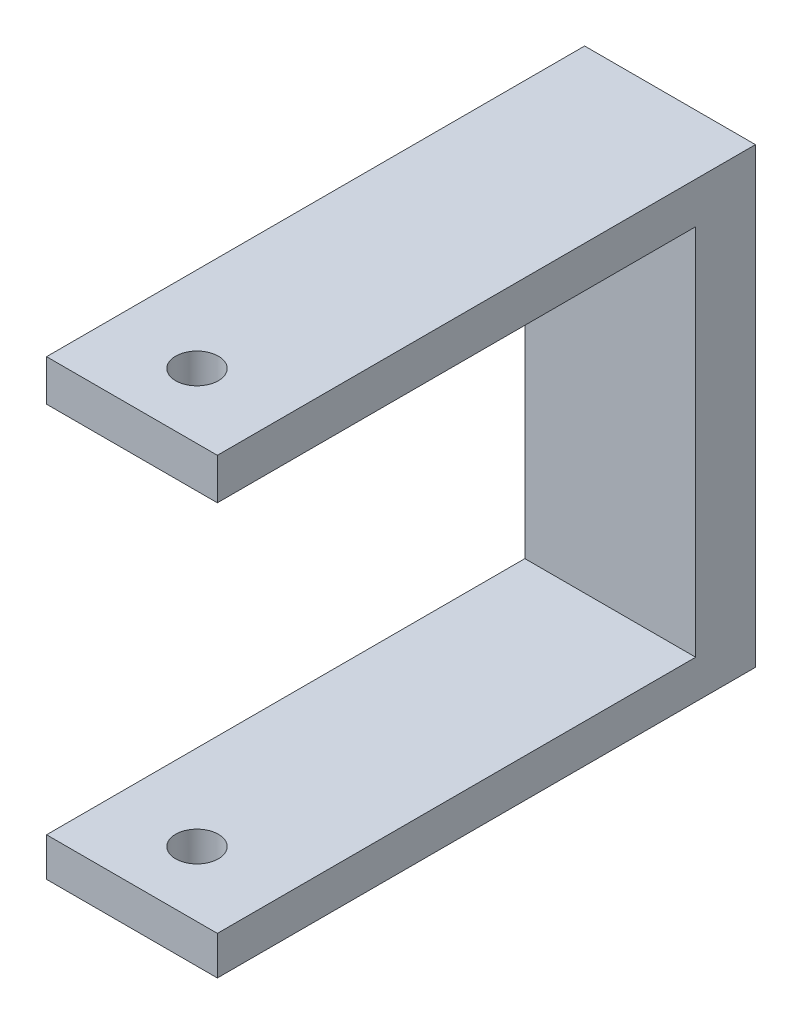
ISO-10303-21;
HEADER;
FILE_DESCRIPTION(('STEP AP214'),'2;1');
FILE_NAME('part.step','',(''),(''),'','','');
FILE_SCHEMA(('AUTOMOTIVE_DESIGN { 1 0 10303 214 1 1 1 1 }'));
ENDSEC;
DATA;
#1=APPLICATION_CONTEXT('core data for automotive mechanical design processes');
#2=APPLICATION_PROTOCOL_DEFINITION('international standard','automotive_design',2000,#1);
#3=PRODUCT_CONTEXT('',#1,'mechanical');
#4=PRODUCT('Part','Part','',(#3));
#5=PRODUCT_RELATED_PRODUCT_CATEGORY('part','',(#4));
#6=PRODUCT_DEFINITION_FORMATION('','',#4);
#7=PRODUCT_DEFINITION_CONTEXT('part definition',#1,'design');
#8=PRODUCT_DEFINITION('design','',#6,#7);
#9=PRODUCT_DEFINITION_SHAPE('','',#8);
#10=(LENGTH_UNIT() NAMED_UNIT(*) SI_UNIT(.MILLI.,.METRE.));
#11=(NAMED_UNIT(*) PLANE_ANGLE_UNIT() SI_UNIT($,.RADIAN.));
#12=(NAMED_UNIT(*) SI_UNIT($,.STERADIAN.) SOLID_ANGLE_UNIT());
#13=UNCERTAINTY_MEASURE_WITH_UNIT(LENGTH_MEASURE(1.E-05),#10,'distance_accuracy_value','');
#14=(GEOMETRIC_REPRESENTATION_CONTEXT(3) GLOBAL_UNCERTAINTY_ASSIGNED_CONTEXT((#13)) GLOBAL_UNIT_ASSIGNED_CONTEXT((#10,
#11,#12)) REPRESENTATION_CONTEXT('',''));
#15=CARTESIAN_POINT('',(0.,0.,0.));
#16=DIRECTION('',(0.,0.,1.));
#17=DIRECTION('',(1.,0.,0.));
#18=AXIS2_PLACEMENT_3D('',#15,#16,#17);
#19=CARTESIAN_POINT('',(10.,53.,-50.));
#20=DIRECTION('',(-1.,0.,0.));
#21=DIRECTION('',(0.,0.,1.));
#22=AXIS2_PLACEMENT_3D('',#19,#20,#21);
#23=PLANE('',#22);
#24=DIRECTION('',(0.,1.,0.));
#25=VECTOR('',#24,1.);
#26=CARTESIAN_POINT('',(10.,53.,13.));
#27=LINE('',#26,#25);
#28=CARTESIAN_POINT('',(10.,0.,13.));
#29=VERTEX_POINT('',#28);
#30=CARTESIAN_POINT('',(10.,4.52405347124341,13.));
#31=VERTEX_POINT('',#30);
#32=EDGE_CURVE('E47',#29,#31,#27,.T.);
#33=ORIENTED_EDGE('',*,*,#32,.F.);
#34=DIRECTION('',(0.,0.,-1.));
#35=VECTOR('',#34,1.);
#36=CARTESIAN_POINT('',(10.,0.,-50.));
#37=LINE('',#36,#35);
#38=CARTESIAN_POINT('',(10.,0.,-50.));
#39=VERTEX_POINT('',#38);
#40=EDGE_CURVE('E110',#29,#39,#37,.T.);
#41=ORIENTED_EDGE('',*,*,#40,.T.);
#42=DIRECTION('',(0.,-1.,0.));
#43=VECTOR('',#42,1.);
#44=CARTESIAN_POINT('',(10.,53.,-50.));
#45=LINE('',#44,#43);
#46=CARTESIAN_POINT('',(10.,53.,-50.));
#47=VERTEX_POINT('',#46);
#48=EDGE_CURVE('E40',#47,#39,#45,.T.);
#49=ORIENTED_EDGE('',*,*,#48,.F.);
#50=DIRECTION('',(0.,0.,-1.));
#51=VECTOR('',#50,1.);
#52=CARTESIAN_POINT('',(10.,53.,-50.));
#53=LINE('',#52,#51);
#54=CARTESIAN_POINT('',(10.,53.,13.));
#55=VERTEX_POINT('',#54);
#56=EDGE_CURVE('E118',#55,#47,#53,.T.);
#57=ORIENTED_EDGE('',*,*,#56,.F.);
#58=CARTESIAN_POINT('',(10.,48.1796211530856,13.));
#59=VERTEX_POINT('',#58);
#60=EDGE_CURVE('E111',#59,#55,#27,.T.);
#61=ORIENTED_EDGE('',*,*,#60,.F.);
#62=DIRECTION('',(0.,0.,1.));
#63=VECTOR('',#62,1.);
#64=CARTESIAN_POINT('',(10.,48.1796211530856,-43.));
#65=LINE('',#64,#63);
#66=CARTESIAN_POINT('',(10.,48.1796211530856,-43.));
#67=VERTEX_POINT('',#66);
#68=EDGE_CURVE('E151',#67,#59,#65,.T.);
#69=ORIENTED_EDGE('',*,*,#68,.F.);
#70=DIRECTION('',(0.,1.,0.));
#71=VECTOR('',#70,1.);
#72=CARTESIAN_POINT('',(10.,4.52405347124341,-43.));
#73=LINE('',#72,#71);
#74=CARTESIAN_POINT('',(10.,4.52405347124341,-43.));
#75=VERTEX_POINT('',#74);
#76=EDGE_CURVE('E155',#75,#67,#73,.T.);
#77=ORIENTED_EDGE('',*,*,#76,.F.);
#78=DIRECTION('',(0.,0.,1.));
#79=VECTOR('',#78,1.);
#80=CARTESIAN_POINT('',(10.,4.52405347124341,-43.));
#81=LINE('',#80,#79);
#82=EDGE_CURVE('E165',#75,#31,#81,.T.);
#83=ORIENTED_EDGE('',*,*,#82,.T.);
#84=EDGE_LOOP('',(#33,#41,#49,#57,#61,#69,#77,#83));
#85=FACE_BOUND('',#84,.T.);
#86=ADVANCED_FACE('F33',(#85),#23,.F.);
#87=CARTESIAN_POINT('',(-10.,53.,-50.));
#88=DIRECTION('',(1.,0.,0.));
#89=DIRECTION('',(0.,0.,-1.));
#90=AXIS2_PLACEMENT_3D('',#87,#88,#89);
#91=PLANE('',#90);
#92=DIRECTION('',(0.,-1.,0.));
#93=VECTOR('',#92,1.);
#94=CARTESIAN_POINT('',(-10.,53.,13.));
#95=LINE('',#94,#93);
#96=CARTESIAN_POINT('',(-10.,53.,13.));
#97=VERTEX_POINT('',#96);
#98=CARTESIAN_POINT('',(-10.,48.1796211530856,13.));
#99=VERTEX_POINT('',#98);
#100=EDGE_CURVE('E54',#97,#99,#95,.T.);
#101=ORIENTED_EDGE('',*,*,#100,.F.);
#102=DIRECTION('',(0.,0.,1.));
#103=VECTOR('',#102,1.);
#104=CARTESIAN_POINT('',(-10.,53.,-50.));
#105=LINE('',#104,#103);
#106=CARTESIAN_POINT('',(-10.,53.,-50.));
#107=VERTEX_POINT('',#106);
#108=EDGE_CURVE('E127',#107,#97,#105,.T.);
#109=ORIENTED_EDGE('',*,*,#108,.F.);
#110=DIRECTION('',(0.,-1.,0.));
#111=VECTOR('',#110,1.);
#112=CARTESIAN_POINT('',(-10.,53.,-50.));
#113=LINE('',#112,#111);
#114=CARTESIAN_POINT('',(-10.,0.,-50.));
#115=VERTEX_POINT('',#114);
#116=EDGE_CURVE('E117',#107,#115,#113,.T.);
#117=ORIENTED_EDGE('',*,*,#116,.T.);
#118=DIRECTION('',(0.,0.,1.));
#119=VECTOR('',#118,1.);
#120=CARTESIAN_POINT('',(-10.,0.,-50.));
#121=LINE('',#120,#119);
#122=CARTESIAN_POINT('',(-10.,0.,13.));
#123=VERTEX_POINT('',#122);
#124=EDGE_CURVE('E109',#115,#123,#121,.T.);
#125=ORIENTED_EDGE('',*,*,#124,.T.);
#126=CARTESIAN_POINT('',(-10.,4.52405347124341,13.));
#127=VERTEX_POINT('',#126);
#128=EDGE_CURVE('E94',#127,#123,#95,.T.);
#129=ORIENTED_EDGE('',*,*,#128,.F.);
#130=DIRECTION('',(0.,0.,1.));
#131=VECTOR('',#130,1.);
#132=CARTESIAN_POINT('',(-10.,4.52405347124341,-43.));
#133=LINE('',#132,#131);
#134=CARTESIAN_POINT('',(-10.,4.52405347124341,-43.));
#135=VERTEX_POINT('',#134);
#136=EDGE_CURVE('E164',#135,#127,#133,.T.);
#137=ORIENTED_EDGE('',*,*,#136,.F.);
#138=DIRECTION('',(0.,-1.,0.));
#139=VECTOR('',#138,1.);
#140=CARTESIAN_POINT('',(-10.,4.52405347124341,-43.));
#141=LINE('',#140,#139);
#142=CARTESIAN_POINT('',(-10.,48.1796211530856,-43.));
#143=VERTEX_POINT('',#142);
#144=EDGE_CURVE('E159',#143,#135,#141,.T.);
#145=ORIENTED_EDGE('',*,*,#144,.F.);
#146=DIRECTION('',(0.,0.,1.));
#147=VECTOR('',#146,1.);
#148=CARTESIAN_POINT('',(-10.,48.1796211530856,-43.));
#149=LINE('',#148,#147);
#150=EDGE_CURVE('E152',#143,#99,#149,.T.);
#151=ORIENTED_EDGE('',*,*,#150,.T.);
#152=EDGE_LOOP('',(#101,#109,#117,#125,#129,#137,#145,#151));
#153=FACE_BOUND('',#152,.T.);
#154=ADVANCED_FACE('F114',(#153),#91,.F.);
#155=CARTESIAN_POINT('',(0.,53.,0.));
#156=DIRECTION('',(0.,1.,0.));
#157=DIRECTION('',(0.,0.,1.));
#158=AXIS2_PLACEMENT_3D('',#155,#156,#157);
#159=PLANE('',#158);
#160=CARTESIAN_POINT('',(0.,53.,5.38561240630386));
#161=DIRECTION('',(0.,1.,0.));
#162=DIRECTION('',(0.,0.,1.));
#163=AXIS2_PLACEMENT_3D('',#160,#161,#162);
#164=CIRCLE('',#163,2.5);
#165=CARTESIAN_POINT('',(0.,53.,7.88561240630386));
#166=VERTEX_POINT('',#165);
#167=EDGE_CURVE('E132',#166,#166,#164,.T.);
#168=ORIENTED_EDGE('',*,*,#167,.F.);
#169=EDGE_LOOP('',(#168));
#170=FACE_BOUND('',#169,.T.);
#171=ORIENTED_EDGE('',*,*,#108,.T.);
#172=DIRECTION('',(-1.,0.,0.));
#173=VECTOR('',#172,1.);
#174=CARTESIAN_POINT('',(-10.,53.,13.));
#175=LINE('',#174,#173);
#176=EDGE_CURVE('E142',#55,#97,#175,.T.);
#177=ORIENTED_EDGE('',*,*,#176,.F.);
#178=ORIENTED_EDGE('',*,*,#56,.T.);
#179=DIRECTION('',(-1.,0.,0.));
#180=VECTOR('',#179,1.);
#181=CARTESIAN_POINT('',(-10.,53.,-50.));
#182=LINE('',#181,#180);
#183=EDGE_CURVE('E121',#47,#107,#182,.T.);
#184=ORIENTED_EDGE('',*,*,#183,.T.);
#185=EDGE_LOOP('',(#171,#177,#178,#184));
#186=FACE_BOUND('',#185,.T.);
#187=ADVANCED_FACE('F178',(#170,#186),#159,.T.);
#188=CARTESIAN_POINT('',(0.,0.,0.));
#189=DIRECTION('',(0.,1.,0.));
#190=DIRECTION('',(0.,0.,1.));
#191=AXIS2_PLACEMENT_3D('',#188,#189,#190);
#192=PLANE('',#191);
#193=CARTESIAN_POINT('',(0.,0.,5.38561240630386));
#194=DIRECTION('',(0.,1.,0.));
#195=DIRECTION('',(0.,0.,1.));
#196=AXIS2_PLACEMENT_3D('',#193,#194,#195);
#197=CIRCLE('',#196,2.5);
#198=CARTESIAN_POINT('',(0.,0.,7.88561240630386));
#199=VERTEX_POINT('',#198);
#200=EDGE_CURVE('E136',#199,#199,#197,.T.);
#201=ORIENTED_EDGE('',*,*,#200,.T.);
#202=EDGE_LOOP('',(#201));
#203=FACE_BOUND('',#202,.T.);
#204=DIRECTION('',(1.,0.,0.));
#205=VECTOR('',#204,1.);
#206=CARTESIAN_POINT('',(-10.,0.,13.));
#207=LINE('',#206,#205);
#208=EDGE_CURVE('E97',#123,#29,#207,.T.);
#209=ORIENTED_EDGE('',*,*,#208,.F.);
#210=ORIENTED_EDGE('',*,*,#124,.F.);
#211=DIRECTION('',(-1.,0.,0.));
#212=VECTOR('',#211,1.);
#213=CARTESIAN_POINT('',(-10.,0.,-50.));
#214=LINE('',#213,#212);
#215=EDGE_CURVE('E119',#39,#115,#214,.T.);
#216=ORIENTED_EDGE('',*,*,#215,.F.);
#217=ORIENTED_EDGE('',*,*,#40,.F.);
#218=EDGE_LOOP('',(#209,#210,#216,#217));
#219=FACE_BOUND('',#218,.T.);
#220=ADVANCED_FACE('F107',(#203,#219),#192,.F.);
#221=CARTESIAN_POINT('',(10.,4.52405347124341,-43.));
#222=DIRECTION('',(0.,-1.,0.));
#223=DIRECTION('',(0.,0.,-1.));
#224=AXIS2_PLACEMENT_3D('',#221,#222,#223);
#225=PLANE('',#224);
#226=CARTESIAN_POINT('',(0.,4.52405347124341,5.38561240630386));
#227=DIRECTION('',(0.,-1.,0.));
#228=DIRECTION('',(0.,0.,-1.));
#229=AXIS2_PLACEMENT_3D('',#226,#227,#228);
#230=CIRCLE('',#229,2.5);
#231=CARTESIAN_POINT('',(0.,4.52405347124341,2.88561240630386));
#232=VERTEX_POINT('',#231);
#233=EDGE_CURVE('E131',#232,#232,#230,.T.);
#234=ORIENTED_EDGE('',*,*,#233,.T.);
#235=EDGE_LOOP('',(#234));
#236=FACE_BOUND('',#235,.T.);
#237=DIRECTION('',(-1.,0.,0.));
#238=VECTOR('',#237,1.);
#239=CARTESIAN_POINT('',(10.,4.52405347124341,13.));
#240=LINE('',#239,#238);
#241=EDGE_CURVE('E98',#31,#127,#240,.T.);
#242=ORIENTED_EDGE('',*,*,#241,.F.);
#243=ORIENTED_EDGE('',*,*,#82,.F.);
#244=DIRECTION('',(1.,0.,0.));
#245=VECTOR('',#244,1.);
#246=CARTESIAN_POINT('',(10.,4.52405347124341,-43.));
#247=LINE('',#246,#245);
#248=EDGE_CURVE('E161',#135,#75,#247,.T.);
#249=ORIENTED_EDGE('',*,*,#248,.F.);
#250=ORIENTED_EDGE('',*,*,#136,.T.);
#251=EDGE_LOOP('',(#242,#243,#249,#250));
#252=FACE_BOUND('',#251,.T.);
#253=ADVANCED_FACE('F192',(#236,#252),#225,.F.);
#254=CARTESIAN_POINT('',(10.,48.1796211530856,-43.));
#255=DIRECTION('',(0.,1.,0.));
#256=DIRECTION('',(0.,0.,1.));
#257=AXIS2_PLACEMENT_3D('',#254,#255,#256);
#258=PLANE('',#257);
#259=CARTESIAN_POINT('',(0.,48.1796211530856,5.38561240630386));
#260=DIRECTION('',(0.,1.,0.));
#261=DIRECTION('',(0.,0.,1.));
#262=AXIS2_PLACEMENT_3D('',#259,#260,#261);
#263=CIRCLE('',#262,2.5);
#264=CARTESIAN_POINT('',(0.,48.1796211530856,7.88561240630386));
#265=VERTEX_POINT('',#264);
#266=EDGE_CURVE('E129',#265,#265,#263,.T.);
#267=ORIENTED_EDGE('',*,*,#266,.T.);
#268=EDGE_LOOP('',(#267));
#269=FACE_BOUND('',#268,.T.);
#270=DIRECTION('',(1.,0.,0.));
#271=VECTOR('',#270,1.);
#272=CARTESIAN_POINT('',(10.,48.1796211530856,13.));
#273=LINE('',#272,#271);
#274=EDGE_CURVE('E11',#99,#59,#273,.T.);
#275=ORIENTED_EDGE('',*,*,#274,.F.);
#276=ORIENTED_EDGE('',*,*,#150,.F.);
#277=DIRECTION('',(-1.,0.,0.));
#278=VECTOR('',#277,1.);
#279=CARTESIAN_POINT('',(10.,48.1796211530856,-43.));
#280=LINE('',#279,#278);
#281=EDGE_CURVE('E148',#67,#143,#280,.T.);
#282=ORIENTED_EDGE('',*,*,#281,.F.);
#283=ORIENTED_EDGE('',*,*,#68,.T.);
#284=EDGE_LOOP('',(#275,#276,#282,#283));
#285=FACE_BOUND('',#284,.T.);
#286=ADVANCED_FACE('F186',(#269,#285),#258,.F.);
#287=CARTESIAN_POINT('',(-10.,53.,-50.));
#288=DIRECTION('',(0.,0.,1.));
#289=DIRECTION('',(1.,0.,0.));
#290=AXIS2_PLACEMENT_3D('',#287,#288,#289);
#291=PLANE('',#290);
#292=ORIENTED_EDGE('',*,*,#215,.T.);
#293=ORIENTED_EDGE('',*,*,#116,.F.);
#294=ORIENTED_EDGE('',*,*,#183,.F.);
#295=ORIENTED_EDGE('',*,*,#48,.T.);
#296=EDGE_LOOP('',(#292,#293,#294,#295));
#297=FACE_BOUND('',#296,.T.);
#298=ADVANCED_FACE('F176',(#297),#291,.F.);
#299=CARTESIAN_POINT('',(0.,0.,-43.));
#300=DIRECTION('',(0.,0.,1.));
#301=DIRECTION('',(1.,0.,0.));
#302=AXIS2_PLACEMENT_3D('',#299,#300,#301);
#303=PLANE('',#302);
#304=ORIENTED_EDGE('',*,*,#76,.T.);
#305=ORIENTED_EDGE('',*,*,#281,.T.);
#306=ORIENTED_EDGE('',*,*,#144,.T.);
#307=ORIENTED_EDGE('',*,*,#248,.T.);
#308=EDGE_LOOP('',(#304,#305,#306,#307));
#309=FACE_BOUND('',#308,.T.);
#310=ADVANCED_FACE('F189',(#309),#303,.T.);
#311=CARTESIAN_POINT('',(0.,-17.,5.38561240630386));
#312=DIRECTION('',(0.,1.,0.));
#313=DIRECTION('',(0.,0.,1.));
#314=AXIS2_PLACEMENT_3D('',#311,#312,#313);
#315=CYLINDRICAL_SURFACE('',#314,2.5);
#316=ORIENTED_EDGE('',*,*,#167,.T.);
#317=EDGE_LOOP('',(#316));
#318=FACE_BOUND('',#317,.T.);
#319=ORIENTED_EDGE('',*,*,#266,.F.);
#320=EDGE_LOOP('',(#319));
#321=FACE_BOUND('',#320,.T.);
#322=ADVANCED_FACE('F201',(#318,#321),#315,.F.);
#323=ORIENTED_EDGE('',*,*,#233,.F.);
#324=EDGE_LOOP('',(#323));
#325=FACE_BOUND('',#324,.T.);
#326=ORIENTED_EDGE('',*,*,#200,.F.);
#327=EDGE_LOOP('',(#326));
#328=FACE_BOUND('',#327,.T.);
#329=ADVANCED_FACE('F195',(#325,#328),#315,.F.);
#330=CARTESIAN_POINT('',(0.,0.,13.));
#331=DIRECTION('',(0.,0.,1.));
#332=DIRECTION('',(1.,0.,0.));
#333=AXIS2_PLACEMENT_3D('',#330,#331,#332);
#334=PLANE('',#333);
#335=ORIENTED_EDGE('',*,*,#274,.T.);
#336=ORIENTED_EDGE('',*,*,#60,.T.);
#337=ORIENTED_EDGE('',*,*,#176,.T.);
#338=ORIENTED_EDGE('',*,*,#100,.T.);
#339=EDGE_LOOP('',(#335,#336,#337,#338));
#340=FACE_BOUND('',#339,.T.);
#341=ADVANCED_FACE('F193',(#340),#334,.T.);
#342=ORIENTED_EDGE('',*,*,#241,.T.);
#343=ORIENTED_EDGE('',*,*,#128,.T.);
#344=ORIENTED_EDGE('',*,*,#208,.T.);
#345=ORIENTED_EDGE('',*,*,#32,.T.);
#346=EDGE_LOOP('',(#342,#343,#344,#345));
#347=FACE_BOUND('',#346,.T.);
#348=ADVANCED_FACE('F96',(#347),#334,.T.);
#349=CLOSED_SHELL('',(#86,#154,#187,#220,#253,#286,#298,#310,#322,#329,#341,#348));
#350=MANIFOLD_SOLID_BREP('B2',#349);
#351=ADVANCED_BREP_SHAPE_REPRESENTATION('',(#18,#350),#14);
#352=SHAPE_DEFINITION_REPRESENTATION(#9,#351);
ENDSEC;
END-ISO-10303-21;
